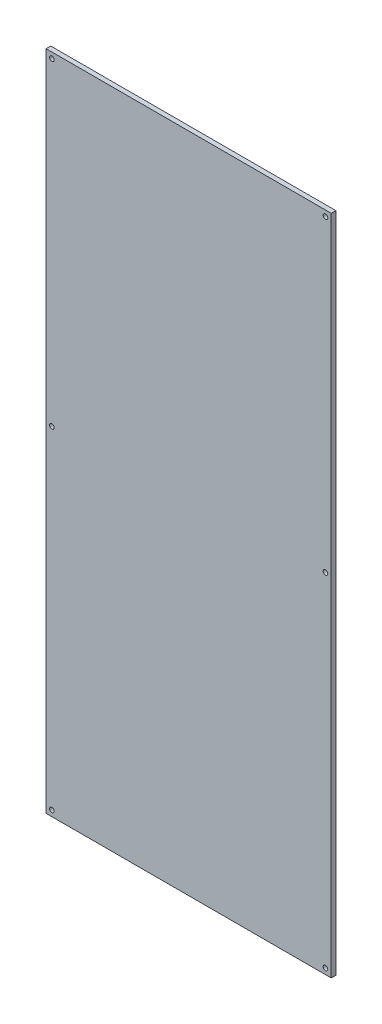
ISO-10303-21;
HEADER;
FILE_DESCRIPTION(('STEP AP214'),'2;1');
FILE_NAME('part.step','',(''),(''),'','','');
FILE_SCHEMA(('AUTOMOTIVE_DESIGN { 1 0 10303 214 1 1 1 1 }'));
ENDSEC;
DATA;
#1=APPLICATION_CONTEXT('core data for automotive mechanical design processes');
#2=APPLICATION_PROTOCOL_DEFINITION('international standard','automotive_design',2000,#1);
#3=PRODUCT_CONTEXT('',#1,'mechanical');
#4=PRODUCT('Part','Part','',(#3));
#5=PRODUCT_RELATED_PRODUCT_CATEGORY('part','',(#4));
#6=PRODUCT_DEFINITION_FORMATION('','',#4);
#7=PRODUCT_DEFINITION_CONTEXT('part definition',#1,'design');
#8=PRODUCT_DEFINITION('design','',#6,#7);
#9=PRODUCT_DEFINITION_SHAPE('','',#8);
#10=(LENGTH_UNIT() NAMED_UNIT(*) SI_UNIT(.MILLI.,.METRE.));
#11=(NAMED_UNIT(*) PLANE_ANGLE_UNIT() SI_UNIT($,.RADIAN.));
#12=(NAMED_UNIT(*) SI_UNIT($,.STERADIAN.) SOLID_ANGLE_UNIT());
#13=UNCERTAINTY_MEASURE_WITH_UNIT(LENGTH_MEASURE(1.E-05),#10,'distance_accuracy_value','');
#14=(GEOMETRIC_REPRESENTATION_CONTEXT(3) GLOBAL_UNCERTAINTY_ASSIGNED_CONTEXT((#13)) GLOBAL_UNIT_ASSIGNED_CONTEXT((#10,
#11,#12)) REPRESENTATION_CONTEXT('',''));
#15=CARTESIAN_POINT('',(0.,0.,0.));
#16=DIRECTION('',(0.,0.,1.));
#17=DIRECTION('',(1.,0.,0.));
#18=AXIS2_PLACEMENT_3D('',#15,#16,#17);
#19=CARTESIAN_POINT('',(0.,0.,2.));
#20=DIRECTION('',(0.,0.,1.));
#21=DIRECTION('',(1.,0.,0.));
#22=AXIS2_PLACEMENT_3D('',#19,#20,#21);
#23=PLANE('',#22);
#24=CARTESIAN_POINT('',(81.2610798070759,-253.815780730897,2.));
#25=DIRECTION('',(0.,0.,1.));
#26=DIRECTION('',(1.,0.,0.));
#27=AXIS2_PLACEMENT_3D('',#24,#25,#26);
#28=CIRCLE('',#27,0.999999999999998);
#29=CARTESIAN_POINT('',(82.2610798070759,-253.815780730897,2.));
#30=VERTEX_POINT('',#29);
#31=EDGE_CURVE('E132',#30,#30,#28,.T.);
#32=ORIENTED_EDGE('',*,*,#31,.F.);
#33=EDGE_LOOP('',(#32));
#34=FACE_BOUND('',#33,.T.);
#35=CARTESIAN_POINT('',(-37.2089201929241,-253.815780730897,2.));
#36=DIRECTION('',(0.,0.,1.));
#37=DIRECTION('',(1.,0.,0.));
#38=AXIS2_PLACEMENT_3D('',#35,#36,#37);
#39=CIRCLE('',#38,0.999999999999998);
#40=CARTESIAN_POINT('',(-36.2089201929241,-253.815780730897,2.));
#41=VERTEX_POINT('',#40);
#42=EDGE_CURVE('E120',#41,#41,#39,.T.);
#43=ORIENTED_EDGE('',*,*,#42,.F.);
#44=EDGE_LOOP('',(#43));
#45=FACE_BOUND('',#44,.T.);
#46=CARTESIAN_POINT('',(-37.2089201929242,27.984219269103,2.));
#47=DIRECTION('',(0.,0.,1.));
#48=DIRECTION('',(1.,0.,0.));
#49=AXIS2_PLACEMENT_3D('',#46,#47,#48);
#50=CIRCLE('',#49,0.999999999999998);
#51=CARTESIAN_POINT('',(-36.2089201929242,27.984219269103,2.));
#52=VERTEX_POINT('',#51);
#53=EDGE_CURVE('E99',#52,#52,#50,.T.);
#54=ORIENTED_EDGE('',*,*,#53,.F.);
#55=EDGE_LOOP('',(#54));
#56=FACE_BOUND('',#55,.T.);
#57=DIRECTION('',(0.,-1.,0.));
#58=VECTOR('',#57,1.);
#59=CARTESIAN_POINT('',(-39.7089201929242,30.484219269103,2.));
#60=LINE('',#59,#58);
#61=CARTESIAN_POINT('',(-39.7089201929242,30.484219269103,2.));
#62=VERTEX_POINT('',#61);
#63=CARTESIAN_POINT('',(-39.7089201929241,-256.315780730897,2.));
#64=VERTEX_POINT('',#63);
#65=EDGE_CURVE('E84',#62,#64,#60,.T.);
#66=ORIENTED_EDGE('',*,*,#65,.T.);
#67=DIRECTION('',(1.,0.,0.));
#68=VECTOR('',#67,1.);
#69=CARTESIAN_POINT('',(-39.7089201929241,-256.315780730897,2.));
#70=LINE('',#69,#68);
#71=CARTESIAN_POINT('',(83.7610798070759,-256.315780730897,2.));
#72=VERTEX_POINT('',#71);
#73=EDGE_CURVE('E79',#64,#72,#70,.T.);
#74=ORIENTED_EDGE('',*,*,#73,.T.);
#75=DIRECTION('',(0.,1.,0.));
#76=VECTOR('',#75,1.);
#77=CARTESIAN_POINT('',(83.7610798070758,30.484219269103,2.));
#78=LINE('',#77,#76);
#79=CARTESIAN_POINT('',(83.7610798070758,30.484219269103,2.));
#80=VERTEX_POINT('',#79);
#81=EDGE_CURVE('E82',#72,#80,#78,.T.);
#82=ORIENTED_EDGE('',*,*,#81,.T.);
#83=DIRECTION('',(-1.,0.,0.));
#84=VECTOR('',#83,1.);
#85=CARTESIAN_POINT('',(-39.7089201929242,30.484219269103,2.));
#86=LINE('',#85,#84);
#87=EDGE_CURVE('E49',#80,#62,#86,.T.);
#88=ORIENTED_EDGE('',*,*,#87,.T.);
#89=EDGE_LOOP('',(#66,#74,#82,#88));
#90=FACE_BOUND('',#89,.T.);
#91=CARTESIAN_POINT('',(81.2610798070758,27.984219269103,2.));
#92=DIRECTION('',(0.,0.,1.));
#93=DIRECTION('',(1.,0.,0.));
#94=AXIS2_PLACEMENT_3D('',#91,#92,#93);
#95=CIRCLE('',#94,0.999999999999998);
#96=CARTESIAN_POINT('',(82.2610798070758,27.984219269103,2.));
#97=VERTEX_POINT('',#96);
#98=EDGE_CURVE('E114',#97,#97,#95,.T.);
#99=ORIENTED_EDGE('',*,*,#98,.F.);
#100=EDGE_LOOP('',(#99));
#101=FACE_BOUND('',#100,.T.);
#102=CARTESIAN_POINT('',(-37.2089201929242,-109.915780730897,2.));
#103=DIRECTION('',(0.,0.,1.));
#104=DIRECTION('',(1.,0.,0.));
#105=AXIS2_PLACEMENT_3D('',#102,#103,#104);
#106=CIRCLE('',#105,0.999999999999998);
#107=CARTESIAN_POINT('',(-36.2089201929242,-109.915780730897,2.));
#108=VERTEX_POINT('',#107);
#109=EDGE_CURVE('E126',#108,#108,#106,.T.);
#110=ORIENTED_EDGE('',*,*,#109,.F.);
#111=EDGE_LOOP('',(#110));
#112=FACE_BOUND('',#111,.T.);
#113=CARTESIAN_POINT('',(81.2610798070758,-105.468802806186,2.));
#114=DIRECTION('',(0.,0.,1.));
#115=DIRECTION('',(1.,0.,0.));
#116=AXIS2_PLACEMENT_3D('',#113,#114,#115);
#117=CIRCLE('',#116,0.999999999999998);
#118=CARTESIAN_POINT('',(82.2610798070758,-105.468802806186,2.));
#119=VERTEX_POINT('',#118);
#120=EDGE_CURVE('E138',#119,#119,#117,.T.);
#121=ORIENTED_EDGE('',*,*,#120,.F.);
#122=EDGE_LOOP('',(#121));
#123=FACE_BOUND('',#122,.T.);
#124=ADVANCED_FACE('F32',(#34,#45,#56,#90,#101,#112,#123),#23,.T.);
#125=CARTESIAN_POINT('',(0.,0.,0.));
#126=DIRECTION('',(0.,0.,1.));
#127=DIRECTION('',(1.,0.,0.));
#128=AXIS2_PLACEMENT_3D('',#125,#126,#127);
#129=PLANE('',#128);
#130=CARTESIAN_POINT('',(81.2610798070759,-253.815780730897,0.));
#131=DIRECTION('',(0.,0.,1.));
#132=DIRECTION('',(1.,0.,0.));
#133=AXIS2_PLACEMENT_3D('',#130,#131,#132);
#134=CIRCLE('',#133,0.999999999999998);
#135=CARTESIAN_POINT('',(82.2610798070759,-253.815780730897,0.));
#136=VERTEX_POINT('',#135);
#137=EDGE_CURVE('E135',#136,#136,#134,.T.);
#138=ORIENTED_EDGE('',*,*,#137,.T.);
#139=EDGE_LOOP('',(#138));
#140=FACE_BOUND('',#139,.T.);
#141=CARTESIAN_POINT('',(-37.2089201929241,-253.815780730897,0.));
#142=DIRECTION('',(0.,0.,1.));
#143=DIRECTION('',(1.,0.,0.));
#144=AXIS2_PLACEMENT_3D('',#141,#142,#143);
#145=CIRCLE('',#144,0.999999999999998);
#146=CARTESIAN_POINT('',(-36.2089201929241,-253.815780730897,0.));
#147=VERTEX_POINT('',#146);
#148=EDGE_CURVE('E123',#147,#147,#145,.T.);
#149=ORIENTED_EDGE('',*,*,#148,.T.);
#150=EDGE_LOOP('',(#149));
#151=FACE_BOUND('',#150,.T.);
#152=CARTESIAN_POINT('',(-37.2089201929242,27.984219269103,0.));
#153=DIRECTION('',(0.,0.,1.));
#154=DIRECTION('',(1.,0.,0.));
#155=AXIS2_PLACEMENT_3D('',#152,#153,#154);
#156=CIRCLE('',#155,0.999999999999998);
#157=CARTESIAN_POINT('',(-36.2089201929242,27.984219269103,0.));
#158=VERTEX_POINT('',#157);
#159=EDGE_CURVE('E111',#158,#158,#156,.T.);
#160=ORIENTED_EDGE('',*,*,#159,.T.);
#161=EDGE_LOOP('',(#160));
#162=FACE_BOUND('',#161,.T.);
#163=DIRECTION('',(0.,-1.,0.));
#164=VECTOR('',#163,1.);
#165=CARTESIAN_POINT('',(-39.7089201929242,30.484219269103,0.));
#166=LINE('',#165,#164);
#167=CARTESIAN_POINT('',(-39.7089201929242,30.484219269103,0.));
#168=VERTEX_POINT('',#167);
#169=CARTESIAN_POINT('',(-39.7089201929241,-256.315780730897,0.));
#170=VERTEX_POINT('',#169);
#171=EDGE_CURVE('E96',#168,#170,#166,.T.);
#172=ORIENTED_EDGE('',*,*,#171,.F.);
#173=DIRECTION('',(-1.,0.,0.));
#174=VECTOR('',#173,1.);
#175=CARTESIAN_POINT('',(-39.7089201929242,30.484219269103,0.));
#176=LINE('',#175,#174);
#177=CARTESIAN_POINT('',(83.7610798070758,30.484219269103,0.));
#178=VERTEX_POINT('',#177);
#179=EDGE_CURVE('E72',#178,#168,#176,.T.);
#180=ORIENTED_EDGE('',*,*,#179,.F.);
#181=DIRECTION('',(0.,1.,0.));
#182=VECTOR('',#181,1.);
#183=CARTESIAN_POINT('',(83.7610798070758,30.484219269103,0.));
#184=LINE('',#183,#182);
#185=CARTESIAN_POINT('',(83.7610798070759,-256.315780730897,0.));
#186=VERTEX_POINT('',#185);
#187=EDGE_CURVE('E66',#186,#178,#184,.T.);
#188=ORIENTED_EDGE('',*,*,#187,.F.);
#189=DIRECTION('',(1.,0.,0.));
#190=VECTOR('',#189,1.);
#191=CARTESIAN_POINT('',(-39.7089201929241,-256.315780730897,0.));
#192=LINE('',#191,#190);
#193=EDGE_CURVE('E88',#170,#186,#192,.T.);
#194=ORIENTED_EDGE('',*,*,#193,.F.);
#195=EDGE_LOOP('',(#172,#180,#188,#194));
#196=FACE_BOUND('',#195,.T.);
#197=CARTESIAN_POINT('',(81.2610798070758,27.984219269103,0.));
#198=DIRECTION('',(0.,0.,1.));
#199=DIRECTION('',(1.,0.,0.));
#200=AXIS2_PLACEMENT_3D('',#197,#198,#199);
#201=CIRCLE('',#200,0.999999999999998);
#202=CARTESIAN_POINT('',(82.2610798070758,27.984219269103,0.));
#203=VERTEX_POINT('',#202);
#204=EDGE_CURVE('E117',#203,#203,#201,.T.);
#205=ORIENTED_EDGE('',*,*,#204,.T.);
#206=EDGE_LOOP('',(#205));
#207=FACE_BOUND('',#206,.T.);
#208=CARTESIAN_POINT('',(-37.2089201929242,-109.915780730897,0.));
#209=DIRECTION('',(0.,0.,1.));
#210=DIRECTION('',(1.,0.,0.));
#211=AXIS2_PLACEMENT_3D('',#208,#209,#210);
#212=CIRCLE('',#211,0.999999999999998);
#213=CARTESIAN_POINT('',(-36.2089201929242,-109.915780730897,0.));
#214=VERTEX_POINT('',#213);
#215=EDGE_CURVE('E129',#214,#214,#212,.T.);
#216=ORIENTED_EDGE('',*,*,#215,.T.);
#217=EDGE_LOOP('',(#216));
#218=FACE_BOUND('',#217,.T.);
#219=CARTESIAN_POINT('',(81.2610798070758,-105.468802806186,0.));
#220=DIRECTION('',(0.,0.,1.));
#221=DIRECTION('',(1.,0.,0.));
#222=AXIS2_PLACEMENT_3D('',#219,#220,#221);
#223=CIRCLE('',#222,0.999999999999998);
#224=CARTESIAN_POINT('',(82.2610798070758,-105.468802806186,0.));
#225=VERTEX_POINT('',#224);
#226=EDGE_CURVE('E141',#225,#225,#223,.T.);
#227=ORIENTED_EDGE('',*,*,#226,.T.);
#228=EDGE_LOOP('',(#227));
#229=FACE_BOUND('',#228,.T.);
#230=ADVANCED_FACE('F107',(#140,#151,#162,#196,#207,#218,#229),#129,.F.);
#231=CARTESIAN_POINT('',(-39.7089201929242,30.484219269103,2.));
#232=DIRECTION('',(1.,0.,0.));
#233=DIRECTION('',(0.,1.,0.));
#234=AXIS2_PLACEMENT_3D('',#231,#232,#233);
#235=PLANE('',#234);
#236=ORIENTED_EDGE('',*,*,#171,.T.);
#237=DIRECTION('',(0.,0.,-1.));
#238=VECTOR('',#237,1.);
#239=CARTESIAN_POINT('',(-39.7089201929241,-256.315780730897,2.));
#240=LINE('',#239,#238);
#241=EDGE_CURVE('E11',#64,#170,#240,.T.);
#242=ORIENTED_EDGE('',*,*,#241,.F.);
#243=ORIENTED_EDGE('',*,*,#65,.F.);
#244=DIRECTION('',(0.,0.,-1.));
#245=VECTOR('',#244,1.);
#246=CARTESIAN_POINT('',(-39.7089201929242,30.484219269103,2.));
#247=LINE('',#246,#245);
#248=EDGE_CURVE('E92',#62,#168,#247,.T.);
#249=ORIENTED_EDGE('',*,*,#248,.T.);
#250=EDGE_LOOP('',(#236,#242,#243,#249));
#251=FACE_BOUND('',#250,.T.);
#252=ADVANCED_FACE('F34',(#251),#235,.F.);
#253=CARTESIAN_POINT('',(-39.7089201929241,-256.315780730897,2.));
#254=DIRECTION('',(0.,1.,0.));
#255=DIRECTION('',(0.,0.,1.));
#256=AXIS2_PLACEMENT_3D('',#253,#254,#255);
#257=PLANE('',#256);
#258=ORIENTED_EDGE('',*,*,#193,.T.);
#259=DIRECTION('',(0.,0.,-1.));
#260=VECTOR('',#259,1.);
#261=CARTESIAN_POINT('',(83.7610798070759,-256.315780730897,2.));
#262=LINE('',#261,#260);
#263=EDGE_CURVE('E41',#72,#186,#262,.T.);
#264=ORIENTED_EDGE('',*,*,#263,.F.);
#265=ORIENTED_EDGE('',*,*,#73,.F.);
#266=ORIENTED_EDGE('',*,*,#241,.T.);
#267=EDGE_LOOP('',(#258,#264,#265,#266));
#268=FACE_BOUND('',#267,.T.);
#269=ADVANCED_FACE('F87',(#268),#257,.F.);
#270=CARTESIAN_POINT('',(83.7610798070758,30.484219269103,2.));
#271=DIRECTION('',(-1.,0.,0.));
#272=DIRECTION('',(0.,-1.,0.));
#273=AXIS2_PLACEMENT_3D('',#270,#271,#272);
#274=PLANE('',#273);
#275=ORIENTED_EDGE('',*,*,#187,.T.);
#276=DIRECTION('',(0.,0.,-1.));
#277=VECTOR('',#276,1.);
#278=CARTESIAN_POINT('',(83.7610798070758,30.484219269103,2.));
#279=LINE('',#278,#277);
#280=EDGE_CURVE('E89',#80,#178,#279,.T.);
#281=ORIENTED_EDGE('',*,*,#280,.F.);
#282=ORIENTED_EDGE('',*,*,#81,.F.);
#283=ORIENTED_EDGE('',*,*,#263,.T.);
#284=EDGE_LOOP('',(#275,#281,#282,#283));
#285=FACE_BOUND('',#284,.T.);
#286=ADVANCED_FACE('F90',(#285),#274,.F.);
#287=CARTESIAN_POINT('',(-39.7089201929242,30.484219269103,2.));
#288=DIRECTION('',(0.,-1.,0.));
#289=DIRECTION('',(0.,0.,-1.));
#290=AXIS2_PLACEMENT_3D('',#287,#288,#289);
#291=PLANE('',#290);
#292=ORIENTED_EDGE('',*,*,#179,.T.);
#293=ORIENTED_EDGE('',*,*,#248,.F.);
#294=ORIENTED_EDGE('',*,*,#87,.F.);
#295=ORIENTED_EDGE('',*,*,#280,.T.);
#296=EDGE_LOOP('',(#292,#293,#294,#295));
#297=FACE_BOUND('',#296,.T.);
#298=ADVANCED_FACE('F104',(#297),#291,.F.);
#299=CARTESIAN_POINT('',(-37.2089201929242,27.984219269103,2.));
#300=DIRECTION('',(0.,0.,-1.));
#301=DIRECTION('',(-1.,0.,0.));
#302=AXIS2_PLACEMENT_3D('',#299,#300,#301);
#303=CYLINDRICAL_SURFACE('',#302,0.999999999999998);
#304=ORIENTED_EDGE('',*,*,#53,.T.);
#305=EDGE_LOOP('',(#304));
#306=FACE_BOUND('',#305,.T.);
#307=ORIENTED_EDGE('',*,*,#159,.F.);
#308=EDGE_LOOP('',(#307));
#309=FACE_BOUND('',#308,.T.);
#310=ADVANCED_FACE('F161',(#306,#309),#303,.F.);
#311=CARTESIAN_POINT('',(81.2610798070758,27.984219269103,2.));
#312=DIRECTION('',(0.,0.,-1.));
#313=DIRECTION('',(-1.,0.,0.));
#314=AXIS2_PLACEMENT_3D('',#311,#312,#313);
#315=CYLINDRICAL_SURFACE('',#314,0.999999999999998);
#316=ORIENTED_EDGE('',*,*,#98,.T.);
#317=EDGE_LOOP('',(#316));
#318=FACE_BOUND('',#317,.T.);
#319=ORIENTED_EDGE('',*,*,#204,.F.);
#320=EDGE_LOOP('',(#319));
#321=FACE_BOUND('',#320,.T.);
#322=ADVANCED_FACE('F207',(#318,#321),#315,.F.);
#323=CARTESIAN_POINT('',(-37.2089201929241,-253.815780730897,2.));
#324=DIRECTION('',(0.,0.,-1.));
#325=DIRECTION('',(-1.,0.,0.));
#326=AXIS2_PLACEMENT_3D('',#323,#324,#325);
#327=CYLINDRICAL_SURFACE('',#326,0.999999999999998);
#328=ORIENTED_EDGE('',*,*,#42,.T.);
#329=EDGE_LOOP('',(#328));
#330=FACE_BOUND('',#329,.T.);
#331=ORIENTED_EDGE('',*,*,#148,.F.);
#332=EDGE_LOOP('',(#331));
#333=FACE_BOUND('',#332,.T.);
#334=ADVANCED_FACE('F215',(#330,#333),#327,.F.);
#335=CARTESIAN_POINT('',(-37.2089201929242,-109.915780730897,2.));
#336=DIRECTION('',(0.,0.,-1.));
#337=DIRECTION('',(-1.,0.,0.));
#338=AXIS2_PLACEMENT_3D('',#335,#336,#337);
#339=CYLINDRICAL_SURFACE('',#338,0.999999999999998);
#340=ORIENTED_EDGE('',*,*,#109,.T.);
#341=EDGE_LOOP('',(#340));
#342=FACE_BOUND('',#341,.T.);
#343=ORIENTED_EDGE('',*,*,#215,.F.);
#344=EDGE_LOOP('',(#343));
#345=FACE_BOUND('',#344,.T.);
#346=ADVANCED_FACE('F223',(#342,#345),#339,.F.);
#347=CARTESIAN_POINT('',(81.2610798070759,-253.815780730897,2.));
#348=DIRECTION('',(0.,0.,-1.));
#349=DIRECTION('',(-1.,0.,0.));
#350=AXIS2_PLACEMENT_3D('',#347,#348,#349);
#351=CYLINDRICAL_SURFACE('',#350,0.999999999999998);
#352=ORIENTED_EDGE('',*,*,#31,.T.);
#353=EDGE_LOOP('',(#352));
#354=FACE_BOUND('',#353,.T.);
#355=ORIENTED_EDGE('',*,*,#137,.F.);
#356=EDGE_LOOP('',(#355));
#357=FACE_BOUND('',#356,.T.);
#358=ADVANCED_FACE('F232',(#354,#357),#351,.F.);
#359=CARTESIAN_POINT('',(81.2610798070758,-105.468802806186,2.));
#360=DIRECTION('',(0.,0.,-1.));
#361=DIRECTION('',(-1.,0.,0.));
#362=AXIS2_PLACEMENT_3D('',#359,#360,#361);
#363=CYLINDRICAL_SURFACE('',#362,0.999999999999998);
#364=ORIENTED_EDGE('',*,*,#120,.T.);
#365=EDGE_LOOP('',(#364));
#366=FACE_BOUND('',#365,.T.);
#367=ORIENTED_EDGE('',*,*,#226,.F.);
#368=EDGE_LOOP('',(#367));
#369=FACE_BOUND('',#368,.T.);
#370=ADVANCED_FACE('F147',(#366,#369),#363,.F.);
#371=CLOSED_SHELL('',(#124,#230,#252,#269,#286,#298,#310,#322,#334,#346,#358,#370));
#372=MANIFOLD_SOLID_BREP('B2',#371);
#373=ADVANCED_BREP_SHAPE_REPRESENTATION('',(#18,#372),#14);
#374=SHAPE_DEFINITION_REPRESENTATION(#9,#373);
ENDSEC;
END-ISO-10303-21;
